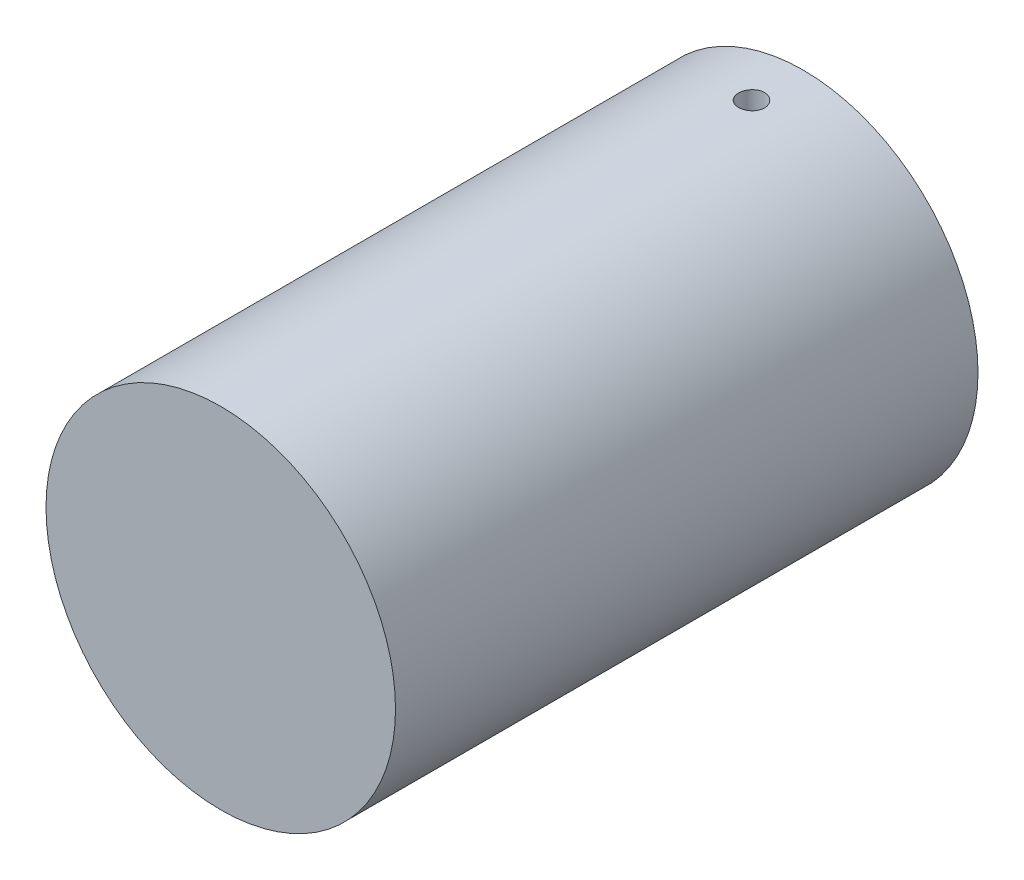
ISO-10303-21;
HEADER;
FILE_DESCRIPTION(('STEP AP214'),'2;1');
FILE_NAME('part.step','',(''),(''),'','','');
FILE_SCHEMA(('AUTOMOTIVE_DESIGN { 1 0 10303 214 1 1 1 1 }'));
ENDSEC;
DATA;
#1=APPLICATION_CONTEXT('core data for automotive mechanical design processes');
#2=APPLICATION_PROTOCOL_DEFINITION('international standard','automotive_design',2000,#1);
#3=PRODUCT_CONTEXT('',#1,'mechanical');
#4=PRODUCT('Part','Part','',(#3));
#5=PRODUCT_RELATED_PRODUCT_CATEGORY('part','',(#4));
#6=PRODUCT_DEFINITION_FORMATION('','',#4);
#7=PRODUCT_DEFINITION_CONTEXT('part definition',#1,'design');
#8=PRODUCT_DEFINITION('design','',#6,#7);
#9=PRODUCT_DEFINITION_SHAPE('','',#8);
#10=(LENGTH_UNIT() NAMED_UNIT(*) SI_UNIT(.MILLI.,.METRE.));
#11=(NAMED_UNIT(*) PLANE_ANGLE_UNIT() SI_UNIT($,.RADIAN.));
#12=(NAMED_UNIT(*) SI_UNIT($,.STERADIAN.) SOLID_ANGLE_UNIT());
#13=UNCERTAINTY_MEASURE_WITH_UNIT(LENGTH_MEASURE(1.E-05),#10,'distance_accuracy_value','');
#14=(GEOMETRIC_REPRESENTATION_CONTEXT(3) GLOBAL_UNCERTAINTY_ASSIGNED_CONTEXT((#13)) GLOBAL_UNIT_ASSIGNED_CONTEXT((#10,
#11,#12)) REPRESENTATION_CONTEXT('',''));
#15=CARTESIAN_POINT('',(0.,0.,0.));
#16=DIRECTION('',(0.,0.,1.));
#17=DIRECTION('',(1.,0.,0.));
#18=AXIS2_PLACEMENT_3D('',#15,#16,#17);
#19=CARTESIAN_POINT('',(0.,0.,45.));
#20=DIRECTION('',(0.,0.,-1.));
#21=DIRECTION('',(-1.,0.,0.));
#22=AXIS2_PLACEMENT_3D('',#19,#20,#21);
#23=CYLINDRICAL_SURFACE('',#22,13.5);
#24=CARTESIAN_POINT('',(0.,-13.5,5.));
#25=CARTESIAN_POINT('',(0.0560879437507615,-13.4999995112953,4.99999754120434));
#26=CARTESIAN_POINT('',(0.11221459313242,-13.4996467283223,4.99526534883604));
#27=CARTESIAN_POINT('',(0.222916480560004,-13.4982733245986,4.97645653196567));
#28=CARTESIAN_POINT('',(0.277489862835121,-13.4972519373251,4.96236918195356));
#29=CARTESIAN_POINT('',(0.383465781846225,-13.4946568065207,4.92525833377747));
#30=CARTESIAN_POINT('',(0.43487003675227,-13.4930833654427,4.90223972803509));
#31=CARTESIAN_POINT('',(0.533072314217248,-13.4895608267732,4.84792815108325));
#32=CARTESIAN_POINT('',(0.579871352249657,-13.4876118122793,4.81663700964504));
#33=CARTESIAN_POINT('',(0.667643302036649,-13.4835525527616,4.74659911998667));
#34=CARTESIAN_POINT('',(0.70860551647936,-13.4814420223292,4.70783898121707));
#35=CARTESIAN_POINT('',(0.783449384668648,-13.4773000138992,4.62399140286789));
#36=CARTESIAN_POINT('',(0.817330734787747,-13.4752685392945,4.57890369210052));
#37=CARTESIAN_POINT('',(0.877086094217641,-13.4715114467936,4.48361765521273));
#38=CARTESIAN_POINT('',(0.902950898004396,-13.4697861814861,4.43341354107042));
#39=CARTESIAN_POINT('',(0.945880121953628,-13.4668398853279,4.32936025216317));
#40=CARTESIAN_POINT('',(0.962944668289714,-13.4656188472478,4.27551112967102));
#41=CARTESIAN_POINT('',(0.987758451951506,-13.4638214984241,4.16580207832661));
#42=CARTESIAN_POINT('',(0.995524871870942,-13.4632439985828,4.1099460555982));
#43=CARTESIAN_POINT('',(1.00157500687875,-13.4627952957486,3.99772044012125));
#44=CARTESIAN_POINT('',(0.999858866042834,-13.4629240820246,3.94135085518864));
#45=CARTESIAN_POINT('',(0.987006819404353,-13.4638723251247,3.82981566823123));
#46=CARTESIAN_POINT('',(0.97588954818716,-13.4646904156232,3.77464790573376));
#47=CARTESIAN_POINT('',(0.944579747969587,-13.4669229353638,3.66696362507983));
#48=CARTESIAN_POINT('',(0.924387146706016,-13.4683373693545,3.61444712803802));
#49=CARTESIAN_POINT('',(0.875478876069685,-13.4716047667135,3.51349650726523));
#50=CARTESIAN_POINT('',(0.846754801736327,-13.4734581621675,3.46506647009749));
#51=CARTESIAN_POINT('',(0.781605028225209,-13.4773942226269,3.37370820113506));
#52=CARTESIAN_POINT('',(0.745179206318048,-13.4794768912854,3.33078005703203));
#53=CARTESIAN_POINT('',(0.665555207623179,-13.4836428911915,3.25153576399663));
#54=CARTESIAN_POINT('',(0.622340912876132,-13.4857262119278,3.21523580772699));
#55=CARTESIAN_POINT('',(0.530423024353947,-13.4896539578957,3.1504033676624));
#56=CARTESIAN_POINT('',(0.481719427840156,-13.4914983830081,3.12187088774273));
#57=CARTESIAN_POINT('',(0.380195262608039,-13.4947407596723,3.07338451359577));
#58=CARTESIAN_POINT('',(0.32737437399218,-13.4961386764892,3.05343128672935));
#59=CARTESIAN_POINT('',(0.219119631754083,-13.4983300958748,3.02268090425285));
#60=CARTESIAN_POINT('',(0.163685820993015,-13.4991236083543,3.01188359850842));
#61=CARTESIAN_POINT('',(0.0519192166388127,-13.5000155351179,2.99977174190468));
#62=CARTESIAN_POINT('',(-0.00441113953764126,-13.5001155896261,2.99843481441899));
#63=CARTESIAN_POINT('',(-0.116495240013602,-13.4996136987834,3.00522311885388));
#64=CARTESIAN_POINT('',(-0.172248988545342,-13.4990117585887,3.01334828127402));
#65=CARTESIAN_POINT('',(-0.281533795333284,-13.4971746606957,3.03881158442023));
#66=CARTESIAN_POINT('',(-0.335067271394595,-13.4959402124507,3.05613940376911));
#67=CARTESIAN_POINT('',(-0.438466681472667,-13.4929768689092,3.09950563479746));
#68=CARTESIAN_POINT('',(-0.488332569375136,-13.4912479673969,3.12554415597781));
#69=CARTESIAN_POINT('',(-0.583083433961914,-13.487485653145,3.18564923616769));
#70=CARTESIAN_POINT('',(-0.627958947535944,-13.4854516784902,3.21973067730835));
#71=CARTESIAN_POINT('',(-0.71135981388001,-13.4813098114879,3.29493257456971));
#72=CARTESIAN_POINT('',(-0.749885079364597,-13.4792019181248,3.33605312742859));
#73=CARTESIAN_POINT('',(-0.819568158623002,-13.4751449771878,3.42426282189006));
#74=CARTESIAN_POINT('',(-0.850711410968977,-13.4731962484542,3.47136348327459));
#75=CARTESIAN_POINT('',(-0.904646695943775,-13.4696825494786,3.57013877729308));
#76=CARTESIAN_POINT('',(-0.92743879680828,-13.468117576101,3.62181337255));
#77=CARTESIAN_POINT('',(-0.963999791444959,-13.4655502035088,3.72821734345339));
#78=CARTESIAN_POINT('',(-0.977777719163464,-13.4645472411955,3.78294360084845));
#79=CARTESIAN_POINT('',(-0.995948720122954,-13.4632154573328,3.89394040935076));
#80=CARTESIAN_POINT('',(-1.00034193164927,-13.46288662585,3.95021093769055));
#81=CARTESIAN_POINT('',(-0.999617334984279,-13.4629404354033,4.06255424250751));
#82=CARTESIAN_POINT('',(-0.994522411124771,-13.4633213645763,4.11862716883237));
#83=CARTESIAN_POINT('',(-0.975013759115566,-13.4647481406555,4.22911882196429));
#84=CARTESIAN_POINT('',(-0.960600015340103,-13.4657939886765,4.28353754599742));
#85=CARTESIAN_POINT('',(-0.92286839013935,-13.4684323184909,4.38917841602407));
#86=CARTESIAN_POINT('',(-0.899550780672064,-13.4700247835883,4.44040065959472));
#87=CARTESIAN_POINT('',(-0.844676091465753,-13.4735769174416,4.53820682990875));
#88=CARTESIAN_POINT('',(-0.813119181224877,-13.4755365786433,4.58479085204198));
#89=CARTESIAN_POINT('',(-0.742576047850048,-13.4796078718083,4.67211502002802));
#90=CARTESIAN_POINT('',(-0.703573010499141,-13.4817198408519,4.7128415669014));
#91=CARTESIAN_POINT('',(-0.619272618646946,-13.4858547523453,4.78718491333292));
#92=CARTESIAN_POINT('',(-0.573973735495022,-13.4878776730162,4.82079998118765));
#93=CARTESIAN_POINT('',(-0.478297548292632,-13.4916094449029,4.88000134672795));
#94=CARTESIAN_POINT('',(-0.42791244031596,-13.4933178017776,4.90557505118755));
#95=CARTESIAN_POINT('',(-0.32358629797167,-13.4962218325543,4.94786759927034));
#96=CARTESIAN_POINT('',(-0.269649470299677,-13.4974181008121,4.96459671369928));
#97=CARTESIAN_POINT('',(-0.17949057653964,-13.4988529927646,4.98442256271956));
#98=CARTESIAN_POINT('',(-0.143849812423339,-13.4992811847637,4.99025643905126));
#99=CARTESIAN_POINT('',(-0.0721447039137161,-13.499854845283,4.99804594461989));
#100=CARTESIAN_POINT('',(-0.0360803603770399,-13.5000003143749,5.00000158169881));
#101=CARTESIAN_POINT('',(0.,-13.5,5.));
#102=B_SPLINE_CURVE_WITH_KNOTS('',3,(#24,#25,#26,#27,#28,#29,#30,#31,#32,#33,#34,#35,#36,#37,
#38,#39,#40,#41,#42,#43,#44,#45,#46,#47,#48,#49,#50,#51,#52,#53,#54,#55,#56,#57,#58,#59,#60,#61,
#62,#63,#64,#65,#66,#67,#68,#69,#70,#71,#72,#73,#74,#75,#76,#77,#78,#79,#80,#81,#82,#83,#84,#85,
#86,#87,#88,#89,#90,#91,#92,#93,#94,#95,#96,#97,#98,#99,#100,#101),.UNSPECIFIED.,.T.,.F.,(4,2,2,
2,2,2,2,2,2,2,2,2,2,2,2,2,2,2,2,2,2,2,2,2,2,2,2,2,2,2,2,2,2,2,2,2,2,2,4),(0.,0.168132107254709,
0.336457308321685,0.504690432993547,0.672886377896605,0.84138672113004,1.00989428817682,
1.1785946442293,1.34729258147476,1.51567828758665,1.68406143529431,1.85211160016204,
2.02016310316911,2.18838071792784,2.35660101348119,2.52522692774794,2.69385292614374,
2.86249203920603,3.0311283869522,3.19936572552328,3.36760182837426,3.53564964075517,
3.7036995657183,3.8720629124455,4.04042857316812,4.20912363095986,4.3778173103454,
4.5463416659762,4.71486353835591,4.88297948096216,5.0510957054654,5.2192067954689,
5.38731442737872,5.55580625451703,5.72433906368957,5.8931345051216,6.06173349941507,
6.16989006357744,6.27804640904195),.UNSPECIFIED.);
#103=CARTESIAN_POINT('',(0.,-13.5,5.));
#104=VERTEX_POINT('',#103);
#105=EDGE_CURVE('E10',#104,#104,#102,.T.);
#106=ORIENTED_EDGE('',*,*,#105,.T.);
#107=EDGE_LOOP('',(#106));
#108=FACE_BOUND('',#107,.T.);
#109=CARTESIAN_POINT('',(0.,13.5,5.));
#110=CARTESIAN_POINT('',(-0.0560879437507615,13.4999995112953,4.99999754120434));
#111=CARTESIAN_POINT('',(-0.11221459313242,13.4996467283223,4.99526534883604));
#112=CARTESIAN_POINT('',(-0.222916480560004,13.4982733245986,4.97645653196567));
#113=CARTESIAN_POINT('',(-0.277489862835121,13.4972519373251,4.96236918195356));
#114=CARTESIAN_POINT('',(-0.383465781846225,13.4946568065207,4.92525833377747));
#115=CARTESIAN_POINT('',(-0.43487003675227,13.4930833654427,4.90223972803509));
#116=CARTESIAN_POINT('',(-0.533072314217248,13.4895608267732,4.84792815108325));
#117=CARTESIAN_POINT('',(-0.579871352249657,13.4876118122793,4.81663700964504));
#118=CARTESIAN_POINT('',(-0.667643302036649,13.4835525527616,4.74659911998667));
#119=CARTESIAN_POINT('',(-0.70860551647936,13.4814420223292,4.70783898121707));
#120=CARTESIAN_POINT('',(-0.783449384668648,13.4773000138992,4.62399140286789));
#121=CARTESIAN_POINT('',(-0.817330734787747,13.4752685392945,4.57890369210052));
#122=CARTESIAN_POINT('',(-0.877086094217641,13.4715114467936,4.48361765521273));
#123=CARTESIAN_POINT('',(-0.902950898004396,13.4697861814861,4.43341354107042));
#124=CARTESIAN_POINT('',(-0.945880121953628,13.4668398853279,4.32936025216317));
#125=CARTESIAN_POINT('',(-0.962944668289714,13.4656188472478,4.27551112967102));
#126=CARTESIAN_POINT('',(-0.987758451951506,13.4638214984241,4.16580207832661));
#127=CARTESIAN_POINT('',(-0.995524871870942,13.4632439985828,4.1099460555982));
#128=CARTESIAN_POINT('',(-1.00157500687875,13.4627952957486,3.99772044012125));
#129=CARTESIAN_POINT('',(-0.999858866042834,13.4629240820246,3.94135085518864));
#130=CARTESIAN_POINT('',(-0.987006819404353,13.4638723251247,3.82981566823123));
#131=CARTESIAN_POINT('',(-0.97588954818716,13.4646904156232,3.77464790573376));
#132=CARTESIAN_POINT('',(-0.944579747969587,13.4669229353638,3.66696362507983));
#133=CARTESIAN_POINT('',(-0.924387146706016,13.4683373693545,3.61444712803802));
#134=CARTESIAN_POINT('',(-0.875478876069685,13.4716047667135,3.51349650726523));
#135=CARTESIAN_POINT('',(-0.846754801736327,13.4734581621675,3.46506647009749));
#136=CARTESIAN_POINT('',(-0.781605028225209,13.4773942226269,3.37370820113506));
#137=CARTESIAN_POINT('',(-0.745179206318048,13.4794768912854,3.33078005703203));
#138=CARTESIAN_POINT('',(-0.665555207623179,13.4836428911915,3.25153576399663));
#139=CARTESIAN_POINT('',(-0.622340912876132,13.4857262119278,3.21523580772699));
#140=CARTESIAN_POINT('',(-0.530423024353947,13.4896539578957,3.1504033676624));
#141=CARTESIAN_POINT('',(-0.481719427840156,13.4914983830081,3.12187088774273));
#142=CARTESIAN_POINT('',(-0.380195262608039,13.4947407596723,3.07338451359577));
#143=CARTESIAN_POINT('',(-0.32737437399218,13.4961386764892,3.05343128672935));
#144=CARTESIAN_POINT('',(-0.219119631754083,13.4983300958748,3.02268090425285));
#145=CARTESIAN_POINT('',(-0.163685820993015,13.4991236083543,3.01188359850842));
#146=CARTESIAN_POINT('',(-0.0519192166388127,13.5000155351179,2.99977174190468));
#147=CARTESIAN_POINT('',(0.00441113953764126,13.5001155896261,2.99843481441899));
#148=CARTESIAN_POINT('',(0.116495240013602,13.4996136987834,3.00522311885388));
#149=CARTESIAN_POINT('',(0.172248988545342,13.4990117585887,3.01334828127402));
#150=CARTESIAN_POINT('',(0.281533795333284,13.4971746606957,3.03881158442023));
#151=CARTESIAN_POINT('',(0.335067271394595,13.4959402124507,3.05613940376911));
#152=CARTESIAN_POINT('',(0.438466681472667,13.4929768689092,3.09950563479746));
#153=CARTESIAN_POINT('',(0.488332569375136,13.4912479673969,3.12554415597781));
#154=CARTESIAN_POINT('',(0.583083433961914,13.487485653145,3.18564923616769));
#155=CARTESIAN_POINT('',(0.627958947535944,13.4854516784902,3.21973067730835));
#156=CARTESIAN_POINT('',(0.71135981388001,13.4813098114879,3.29493257456971));
#157=CARTESIAN_POINT('',(0.749885079364597,13.4792019181248,3.33605312742859));
#158=CARTESIAN_POINT('',(0.819568158623002,13.4751449771878,3.42426282189006));
#159=CARTESIAN_POINT('',(0.850711410968977,13.4731962484542,3.47136348327459));
#160=CARTESIAN_POINT('',(0.904646695943775,13.4696825494786,3.57013877729308));
#161=CARTESIAN_POINT('',(0.92743879680828,13.468117576101,3.62181337255));
#162=CARTESIAN_POINT('',(0.963999791444959,13.4655502035088,3.72821734345339));
#163=CARTESIAN_POINT('',(0.977777719163464,13.4645472411955,3.78294360084845));
#164=CARTESIAN_POINT('',(0.995948720122954,13.4632154573328,3.89394040935076));
#165=CARTESIAN_POINT('',(1.00034193164927,13.46288662585,3.95021093769055));
#166=CARTESIAN_POINT('',(0.999617334984279,13.4629404354033,4.06255424250751));
#167=CARTESIAN_POINT('',(0.994522411124771,13.4633213645763,4.11862716883237));
#168=CARTESIAN_POINT('',(0.975013759115566,13.4647481406555,4.22911882196429));
#169=CARTESIAN_POINT('',(0.960600015340103,13.4657939886765,4.28353754599742));
#170=CARTESIAN_POINT('',(0.92286839013935,13.4684323184909,4.38917841602407));
#171=CARTESIAN_POINT('',(0.899550780672064,13.4700247835883,4.44040065959472));
#172=CARTESIAN_POINT('',(0.844676091465753,13.4735769174416,4.53820682990875));
#173=CARTESIAN_POINT('',(0.813119181224877,13.4755365786433,4.58479085204198));
#174=CARTESIAN_POINT('',(0.742576047850048,13.4796078718083,4.67211502002802));
#175=CARTESIAN_POINT('',(0.703573010499141,13.4817198408519,4.7128415669014));
#176=CARTESIAN_POINT('',(0.619272618646946,13.4858547523453,4.78718491333292));
#177=CARTESIAN_POINT('',(0.573973735495022,13.4878776730162,4.82079998118765));
#178=CARTESIAN_POINT('',(0.478297548292632,13.4916094449029,4.88000134672795));
#179=CARTESIAN_POINT('',(0.42791244031596,13.4933178017776,4.90557505118755));
#180=CARTESIAN_POINT('',(0.32358629797167,13.4962218325543,4.94786759927034));
#181=CARTESIAN_POINT('',(0.269649470299677,13.4974181008121,4.96459671369928));
#182=CARTESIAN_POINT('',(0.17949057653964,13.4988529927646,4.98442256271956));
#183=CARTESIAN_POINT('',(0.143849812423339,13.4992811847637,4.99025643905126));
#184=CARTESIAN_POINT('',(0.0721447039137161,13.499854845283,4.99804594461989));
#185=CARTESIAN_POINT('',(0.0360803603770399,13.5000003143749,5.00000158169881));
#186=CARTESIAN_POINT('',(0.,13.5,5.));
#187=B_SPLINE_CURVE_WITH_KNOTS('',3,(#109,#110,#111,#112,#113,#114,#115,#116,#117,#118,#119,
#120,#121,#122,#123,#124,#125,#126,#127,#128,#129,#130,#131,#132,#133,#134,#135,#136,#137,#138,
#139,#140,#141,#142,#143,#144,#145,#146,#147,#148,#149,#150,#151,#152,#153,#154,#155,#156,#157,
#158,#159,#160,#161,#162,#163,#164,#165,#166,#167,#168,#169,#170,#171,#172,#173,#174,#175,#176,
#177,#178,#179,#180,#181,#182,#183,#184,#185,#186),.UNSPECIFIED.,.T.,.F.,(4,2,2,2,2,2,2,2,2,2,2,
2,2,2,2,2,2,2,2,2,2,2,2,2,2,2,2,2,2,2,2,2,2,2,2,2,2,2,4),(0.,0.168132107254709,
0.336457308321685,0.504690432993547,0.672886377896605,0.84138672113004,1.00989428817682,
1.1785946442293,1.34729258147476,1.51567828758665,1.68406143529431,1.85211160016204,
2.02016310316911,2.18838071792784,2.35660101348119,2.52522692774794,2.69385292614374,
2.86249203920603,3.0311283869522,3.19936572552328,3.36760182837426,3.53564964075517,
3.7036995657183,3.8720629124455,4.04042857316812,4.20912363095986,4.3778173103454,
4.5463416659762,4.71486353835591,4.88297948096216,5.0510957054654,5.2192067954689,
5.38731442737872,5.55580625451703,5.72433906368957,5.8931345051216,6.06173349941507,
6.16989006357744,6.27804640904195),.UNSPECIFIED.);
#188=CARTESIAN_POINT('',(0.,13.5,5.));
#189=VERTEX_POINT('',#188);
#190=EDGE_CURVE('E41',#189,#189,#187,.T.);
#191=ORIENTED_EDGE('',*,*,#190,.T.);
#192=EDGE_LOOP('',(#191));
#193=FACE_BOUND('',#192,.T.);
#194=CARTESIAN_POINT('',(0.,0.,45.));
#195=DIRECTION('',(0.,0.,1.));
#196=DIRECTION('',(1.,0.,0.));
#197=AXIS2_PLACEMENT_3D('',#194,#195,#196);
#198=CIRCLE('',#197,13.5);
#199=CARTESIAN_POINT('',(13.5,0.,45.));
#200=VERTEX_POINT('',#199);
#201=EDGE_CURVE('E45',#200,#200,#198,.T.);
#202=ORIENTED_EDGE('',*,*,#201,.F.);
#203=EDGE_LOOP('',(#202));
#204=FACE_BOUND('',#203,.T.);
#205=CARTESIAN_POINT('',(0.,0.,0.));
#206=DIRECTION('',(0.,0.,1.));
#207=DIRECTION('',(1.,0.,0.));
#208=AXIS2_PLACEMENT_3D('',#205,#206,#207);
#209=CIRCLE('',#208,13.5);
#210=CARTESIAN_POINT('',(13.5,0.,0.));
#211=VERTEX_POINT('',#210);
#212=EDGE_CURVE('E49',#211,#211,#209,.T.);
#213=ORIENTED_EDGE('',*,*,#212,.T.);
#214=EDGE_LOOP('',(#213));
#215=FACE_BOUND('',#214,.T.);
#216=ADVANCED_FACE('F31',(#108,#193,#204,#215),#23,.T.);
#217=CARTESIAN_POINT('',(0.,0.,45.));
#218=DIRECTION('',(0.,0.,1.));
#219=DIRECTION('',(1.,0.,0.));
#220=AXIS2_PLACEMENT_3D('',#217,#218,#219);
#221=PLANE('',#220);
#222=ORIENTED_EDGE('',*,*,#201,.T.);
#223=EDGE_LOOP('',(#222));
#224=FACE_BOUND('',#223,.T.);
#225=ADVANCED_FACE('F60',(#224),#221,.T.);
#226=CARTESIAN_POINT('',(0.,0.,0.));
#227=DIRECTION('',(0.,0.,1.));
#228=DIRECTION('',(1.,0.,0.));
#229=AXIS2_PLACEMENT_3D('',#226,#227,#228);
#230=PLANE('',#229);
#231=ORIENTED_EDGE('',*,*,#212,.F.);
#232=EDGE_LOOP('',(#231));
#233=FACE_BOUND('',#232,.T.);
#234=ADVANCED_FACE('F58',(#233),#230,.F.);
#235=CARTESIAN_POINT('',(0.,-13.5,4.));
#236=DIRECTION('',(0.,1.,0.));
#237=DIRECTION('',(0.,0.,1.));
#238=AXIS2_PLACEMENT_3D('',#235,#236,#237);
#239=CYLINDRICAL_SURFACE('',#238,1.);
#240=ORIENTED_EDGE('',*,*,#190,.F.);
#241=EDGE_LOOP('',(#240));
#242=FACE_BOUND('',#241,.T.);
#243=ORIENTED_EDGE('',*,*,#105,.F.);
#244=EDGE_LOOP('',(#243));
#245=FACE_BOUND('',#244,.T.);
#246=ADVANCED_FACE('F54',(#242,#245),#239,.F.);
#247=CLOSED_SHELL('',(#216,#225,#234,#246));
#248=MANIFOLD_SOLID_BREP('B2',#247);
#249=ADVANCED_BREP_SHAPE_REPRESENTATION('',(#18,#248),#14);
#250=SHAPE_DEFINITION_REPRESENTATION(#9,#249);
ENDSEC;
END-ISO-10303-21;
